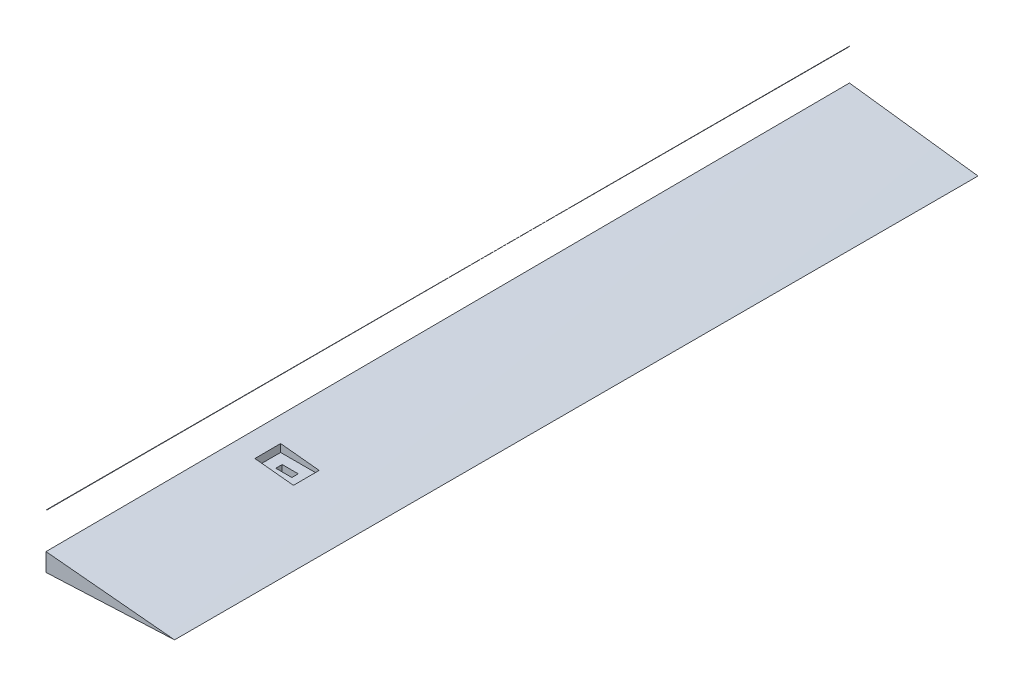
ISO-10303-21;
HEADER;
FILE_DESCRIPTION(('STEP AP214'),'2;1');
FILE_NAME('part.step','',(''),(''),'','','');
FILE_SCHEMA(('AUTOMOTIVE_DESIGN { 1 0 10303 214 1 1 1 1 }'));
ENDSEC;
DATA;
#1=APPLICATION_CONTEXT('core data for automotive mechanical design processes');
#2=APPLICATION_PROTOCOL_DEFINITION('international standard','automotive_design',2000,#1);
#3=PRODUCT_CONTEXT('',#1,'mechanical');
#4=PRODUCT('Part','Part','',(#3));
#5=PRODUCT_RELATED_PRODUCT_CATEGORY('part','',(#4));
#6=PRODUCT_DEFINITION_FORMATION('','',#4);
#7=PRODUCT_DEFINITION_CONTEXT('part definition',#1,'design');
#8=PRODUCT_DEFINITION('design','',#6,#7);
#9=PRODUCT_DEFINITION_SHAPE('','',#8);
#10=(LENGTH_UNIT() NAMED_UNIT(*) SI_UNIT(.MILLI.,.METRE.));
#11=(NAMED_UNIT(*) PLANE_ANGLE_UNIT() SI_UNIT($,.RADIAN.));
#12=(NAMED_UNIT(*) SI_UNIT($,.STERADIAN.) SOLID_ANGLE_UNIT());
#13=UNCERTAINTY_MEASURE_WITH_UNIT(LENGTH_MEASURE(1.E-05),#10,'distance_accuracy_value','');
#14=(GEOMETRIC_REPRESENTATION_CONTEXT(3) GLOBAL_UNCERTAINTY_ASSIGNED_CONTEXT((#13)) GLOBAL_UNIT_ASSIGNED_CONTEXT((#10,
#11,#12)) REPRESENTATION_CONTEXT('',''));
#15=CARTESIAN_POINT('',(0.,0.,0.));
#16=DIRECTION('',(0.,0.,1.));
#17=DIRECTION('',(1.,0.,0.));
#18=AXIS2_PLACEMENT_3D('',#15,#16,#17);
#19=CARTESIAN_POINT('',(0.,15.,125.));
#20=DIRECTION('',(1.,0.,0.));
#21=DIRECTION('',(0.,0.,-1.));
#22=AXIS2_PLACEMENT_3D('',#19,#20,#21);
#23=PLANE('',#22);
#24=DIRECTION('',(0.,-1.,0.));
#25=VECTOR('',#24,1.);
#26=CARTESIAN_POINT('',(0.,15.,-125.));
#27=LINE('',#26,#25);
#28=CARTESIAN_POINT('',(0.,15.,-125.));
#29=VERTEX_POINT('',#28);
#30=CARTESIAN_POINT('',(0.,14.8852225386253,-125.));
#31=VERTEX_POINT('',#30);
#32=EDGE_CURVE('E158',#29,#31,#27,.T.);
#33=ORIENTED_EDGE('',*,*,#32,.T.);
#34=DIRECTION('',(0.,0.000459109797112889,0.999999894609092));
#35=VECTOR('',#34,1.);
#36=CARTESIAN_POINT('',(0.,14.9426112693126,0.));
#37=LINE('',#36,#35);
#38=CARTESIAN_POINT('',(0.,15.,125.));
#39=VERTEX_POINT('',#38);
#40=EDGE_CURVE('E172',#31,#39,#37,.T.);
#41=ORIENTED_EDGE('',*,*,#40,.T.);
#42=DIRECTION('',(0.,0.,-1.));
#43=VECTOR('',#42,1.);
#44=CARTESIAN_POINT('',(0.,15.,125.));
#45=LINE('',#44,#43);
#46=EDGE_CURVE('E185',#39,#29,#45,.T.);
#47=ORIENTED_EDGE('',*,*,#46,.T.);
#48=EDGE_LOOP('',(#33,#41,#47));
#49=FACE_BOUND('',#48,.T.);
#50=ADVANCED_FACE('F155',(#49),#23,.F.);
#51=CARTESIAN_POINT('',(0.,15.,125.));
#52=DIRECTION('',(-0.170786723535938,-0.985308020399641,0.));
#53=DIRECTION('',(0.985308020399641,-0.170786723535938,0.));
#54=AXIS2_PLACEMENT_3D('',#51,#52,#53);
#55=PLANE('',#54);
#56=DIRECTION('',(-0.985308020399641,0.17078672353594,0.));
#57=VECTOR('',#56,1.);
#58=CARTESIAN_POINT('',(0.0645052676879048,14.9888190869341,125.));
#59=LINE('',#58,#57);
#60=CARTESIAN_POINT('',(0.129010535375803,14.9776381738682,125.));
#61=VERTEX_POINT('',#60);
#62=EDGE_CURVE('E13',#61,#39,#59,.T.);
#63=ORIENTED_EDGE('',*,*,#62,.F.);
#64=DIRECTION('',(0.000516042070727968,-8.94472922595131E-05,0.999999862849872));
#65=VECTOR('',#64,1.);
#66=CARTESIAN_POINT('',(0.0645052676879017,14.9888190869341,0.));
#67=LINE('',#66,#65);
#68=EDGE_CURVE('E164',#29,#61,#67,.T.);
#69=ORIENTED_EDGE('',*,*,#68,.F.);
#70=ORIENTED_EDGE('',*,*,#46,.F.);
#71=EDGE_LOOP('',(#63,#69,#70));
#72=FACE_BOUND('',#71,.T.);
#73=ADVANCED_FACE('F184',(#72),#55,.F.);
#74=CARTESIAN_POINT('',(0.,15.,-125.));
#75=CARTESIAN_POINT('',(0.12901053537581,14.9776381738682,125.));
#76=CARTESIAN_POINT('',(0.,14.8852225386253,-125.));
#77=CARTESIAN_POINT('',(0.,15.,125.));
#78=B_SPLINE_SURFACE_WITH_KNOTS('',1,1,((#74,#75),(#76,#77)),.UNSPECIFIED.,.F.,.F.,.F.,(2,2),(2,
2),(0.,1.),(0.,1.),.UNSPECIFIED.);
#79=ORIENTED_EDGE('',*,*,#32,.F.);
#80=ORIENTED_EDGE('',*,*,#68,.T.);
#81=ORIENTED_EDGE('',*,*,#62,.T.);
#82=ORIENTED_EDGE('',*,*,#40,.F.);
#83=EDGE_LOOP('',(#79,#80,#81,#82));
#84=FACE_BOUND('',#83,.T.);
#85=ADVANCED_FACE('F179',(#84),#78,.F.);
#86=CLOSED_SHELL('',(#50,#73,#85));
#87=MANIFOLD_SOLID_BREP('B2',#86);
#88=CARTESIAN_POINT('',(0.,15.,125.));
#89=DIRECTION('',(1.,0.,0.));
#90=DIRECTION('',(0.,0.,-1.));
#91=AXIS2_PLACEMENT_3D('',#88,#89,#90);
#92=PLANE('',#91);
#93=DIRECTION('',(0.,-1.,0.));
#94=VECTOR('',#93,1.);
#95=CARTESIAN_POINT('',(0.,1.28230630065368,95.));
#96=LINE('',#95,#94);
#97=CARTESIAN_POINT('',(0.,1.28230630065368,95.));
#98=VERTEX_POINT('',#97);
#99=CARTESIAN_POINT('',(0.,0.682306300653673,95.));
#100=VERTEX_POINT('',#99);
#101=EDGE_CURVE('E248',#98,#100,#96,.T.);
#102=ORIENTED_EDGE('',*,*,#101,.T.);
#103=DIRECTION('',(0.,0.,-1.));
#104=VECTOR('',#103,1.);
#105=CARTESIAN_POINT('',(0.,0.682306300653676,75.));
#106=LINE('',#105,#104);
#107=CARTESIAN_POINT('',(0.,0.682306300653676,75.));
#108=VERTEX_POINT('',#107);
#109=EDGE_CURVE('E403',#100,#108,#106,.T.);
#110=ORIENTED_EDGE('',*,*,#109,.T.);
#111=DIRECTION('',(0.,1.,0.));
#112=VECTOR('',#111,1.);
#113=CARTESIAN_POINT('',(0.,1.28230630065368,75.));
#114=LINE('',#113,#112);
#115=CARTESIAN_POINT('',(0.,1.28230630065368,75.));
#116=VERTEX_POINT('',#115);
#117=EDGE_CURVE('E399',#108,#116,#114,.T.);
#118=ORIENTED_EDGE('',*,*,#117,.T.);
#119=DIRECTION('',(0.,0.,1.));
#120=VECTOR('',#119,1.);
#121=CARTESIAN_POINT('',(0.,1.28230630065368,75.));
#122=LINE('',#121,#120);
#123=EDGE_CURVE('E396',#116,#98,#122,.T.);
#124=ORIENTED_EDGE('',*,*,#123,.T.);
#125=EDGE_LOOP('',(#102,#110,#118,#124));
#126=FACE_BOUND('',#125,.T.);
#127=DIRECTION('',(0.,-1.,0.));
#128=VECTOR('',#127,1.);
#129=CARTESIAN_POINT('',(0.,15.,125.));
#130=LINE('',#129,#128);
#131=CARTESIAN_POINT('',(0.,3.79304204037742,125.));
#132=VERTEX_POINT('',#131);
#133=CARTESIAN_POINT('',(0.,-1.82842943907007,125.));
#134=VERTEX_POINT('',#133);
#135=EDGE_CURVE('E481',#132,#134,#130,.T.);
#136=ORIENTED_EDGE('',*,*,#135,.F.);
#137=DIRECTION('',(0.,-0.00507239937573968,0.999987135299536));
#138=VECTOR('',#137,1.);
#139=CARTESIAN_POINT('',(-2.35922392732846E-13,4.42710011931214,0.));
#140=LINE('',#139,#138);
#141=CARTESIAN_POINT('',(-4.71844785465692E-13,5.06115819824686,-125.));
#142=VERTEX_POINT('',#141);
#143=EDGE_CURVE('E463',#142,#132,#140,.T.);
#144=ORIENTED_EDGE('',*,*,#143,.F.);
#145=DIRECTION('',(0.,-1.,0.));
#146=VECTOR('',#145,1.);
#147=CARTESIAN_POINT('',(0.,15.,-125.));
#148=LINE('',#147,#146);
#149=CARTESIAN_POINT('',(0.,-1.22896867148071,-125.));
#150=VERTEX_POINT('',#149);
#151=EDGE_CURVE('E465',#142,#150,#148,.T.);
#152=ORIENTED_EDGE('',*,*,#151,.T.);
#153=DIRECTION('',(0.,-0.00239783617700629,0.999997125186702));
#154=VECTOR('',#153,1.);
#155=CARTESIAN_POINT('',(-2.35922392732846E-13,-1.52869905527539,0.));
#156=LINE('',#155,#154);
#157=EDGE_CURVE('E475',#150,#134,#156,.T.);
#158=ORIENTED_EDGE('',*,*,#157,.T.);
#159=EDGE_LOOP('',(#136,#144,#152,#158));
#160=FACE_BOUND('',#159,.T.);
#161=DIRECTION('',(0.,1.,0.));
#162=VECTOR('',#161,1.);
#163=CARTESIAN_POINT('',(0.,1.61609476338308,-95.));
#164=LINE('',#163,#162);
#165=CARTESIAN_POINT('',(0.,1.61609476338308,-95.));
#166=VERTEX_POINT('',#165);
#167=CARTESIAN_POINT('',(0.,2.21609476338308,-95.));
#168=VERTEX_POINT('',#167);
#169=EDGE_CURVE('E240',#166,#168,#164,.T.);
#170=ORIENTED_EDGE('',*,*,#169,.T.);
#171=DIRECTION('',(0.,0.,1.));
#172=VECTOR('',#171,1.);
#173=CARTESIAN_POINT('',(0.,2.21609476338308,-75.));
#174=LINE('',#173,#172);
#175=CARTESIAN_POINT('',(0.,2.21609476338308,-75.));
#176=VERTEX_POINT('',#175);
#177=EDGE_CURVE('E376',#168,#176,#174,.T.);
#178=ORIENTED_EDGE('',*,*,#177,.T.);
#179=DIRECTION('',(0.,-1.,0.));
#180=VECTOR('',#179,1.);
#181=CARTESIAN_POINT('',(0.,1.61609476338308,-75.));
#182=LINE('',#181,#180);
#183=CARTESIAN_POINT('',(0.,1.61609476338308,-75.));
#184=VERTEX_POINT('',#183);
#185=EDGE_CURVE('E567',#176,#184,#182,.T.);
#186=ORIENTED_EDGE('',*,*,#185,.T.);
#187=DIRECTION('',(0.,0.,-1.));
#188=VECTOR('',#187,1.);
#189=CARTESIAN_POINT('',(0.,1.61609476338308,-75.));
#190=LINE('',#189,#188);
#191=EDGE_CURVE('E372',#184,#166,#190,.T.);
#192=ORIENTED_EDGE('',*,*,#191,.T.);
#193=EDGE_LOOP('',(#170,#178,#186,#192));
#194=FACE_BOUND('',#193,.T.);
#195=ADVANCED_FACE('F220',(#126,#160,#194),#92,.F.);
#196=CARTESIAN_POINT('',(-4.71844785465692E-13,5.06115819824686,-125.));
#197=CARTESIAN_POINT('',(0.,3.79304204037742,125.));
#198=CARTESIAN_POINT('',(39.9999910417339,0.,-125.));
#199=CARTESIAN_POINT('',(39.9999999999991,0.,125.));
#200=B_SPLINE_SURFACE_WITH_KNOTS('',1,1,((#196,#197),(#198,#199)),.UNSPECIFIED.,.F.,.F.,.F.,(2,
2),(2,2),(0.,1.),(0.,1.),.UNSPECIFIED.);
#201=DIRECTION('',(0.992090058637647,-0.12552814645469,0.));
#202=VECTOR('',#201,1.);
#203=CARTESIAN_POINT('',(19.9999955208667,2.53057909912343,-125.));
#204=LINE('',#203,#202);
#205=CARTESIAN_POINT('',(39.9999910417339,0.,-125.));
#206=VERTEX_POINT('',#205);
#207=EDGE_CURVE('E466',#142,#206,#204,.T.);
#208=DIRECTION('',(0.995534105483029,-0.0944025678681686,0.));
#209=VECTOR('',#208,1.);
#210=CARTESIAN_POINT('',(19.9999999999995,1.89652102018871,125.));
#211=LINE('',#210,#209);
#212=CARTESIAN_POINT('',(39.9999999999991,0.,125.));
#213=VERTEX_POINT('',#212);
#214=EDGE_CURVE('E478',#132,#213,#211,.T.);
#215=DIRECTION('',(3.58330607408419E-08,0.,0.999999999999999));
#216=VECTOR('',#215,1.);
#217=CARTESIAN_POINT('',(39.9999955208665,0.,0.));
#218=LINE('',#217,#216);
#219=EDGE_CURVE('E469',#206,#213,#218,.T.);
#220=CARTESIAN_POINT('',(7.,3.40545533978554,59.));
#221=CARTESIAN_POINT('',(7.,3.39429591944493,61.6666666666667));
#222=CARTESIAN_POINT('',(7.,3.38313649910432,64.3333333333333));
#223=CARTESIAN_POINT('',(7.,3.37197707876371,67.));
#224=B_SPLINE_CURVE_WITH_KNOTS('',3,(#220,#221,#222,#223),.UNSPECIFIED.,.F.,.F.,(4,4),(0.,
8.00007004931589),.UNSPECIFIED.);
#225=CARTESIAN_POINT('',(7.,3.40545533978554,59.));
#226=VERTEX_POINT('',#225);
#227=CARTESIAN_POINT('',(7.,3.37197707876371,67.));
#228=VERTEX_POINT('',#227);
#229=EDGE_CURVE('E153',#226,#228,#224,.T.);
#230=CARTESIAN_POINT('',(19.,2.1671078547523,59.));
#231=CARTESIAN_POINT('',(15.,2.57989034976338,59.));
#232=CARTESIAN_POINT('',(11.,2.99267284477446,59.));
#233=CARTESIAN_POINT('',(7.,3.40545533978554,59.));
#234=B_SPLINE_CURVE_WITH_KNOTS('',3,(#230,#231,#232,#233),.UNSPECIFIED.,.F.,.F.,(4,4),(0.,
12.0637268078189),.UNSPECIFIED.);
#235=CARTESIAN_POINT('',(19.,2.1671078547523,59.));
#236=VERTEX_POINT('',#235);
#237=EDGE_CURVE('E484',#236,#226,#234,.T.);
#238=CARTESIAN_POINT('',(19.,2.1458035183533,67.));
#239=CARTESIAN_POINT('',(19.,2.15290496381963,64.3333333333333));
#240=CARTESIAN_POINT('',(19.,2.16000640928596,61.6666666666667));
#241=CARTESIAN_POINT('',(19.,2.1671078547523,59.));
#242=B_SPLINE_CURVE_WITH_KNOTS('',3,(#238,#239,#240,#241),.UNSPECIFIED.,.F.,.F.,(4,4),(0.,
8.00002836712155),.UNSPECIFIED.);
#243=CARTESIAN_POINT('',(19.,2.1458035183533,67.));
#244=VERTEX_POINT('',#243);
#245=EDGE_CURVE('E493',#244,#236,#242,.T.);
#246=CARTESIAN_POINT('',(7.,3.37197707876371,67.));
#247=CARTESIAN_POINT('',(11.,2.96325255862691,67.));
#248=CARTESIAN_POINT('',(15.,2.5545280384901,67.));
#249=CARTESIAN_POINT('',(19.,2.1458035183533,67.));
#250=B_SPLINE_CURVE_WITH_KNOTS('',3,(#246,#247,#248,#249),.UNSPECIFIED.,.F.,.F.,(4,4),(0.,
12.0624832269417),.UNSPECIFIED.);
#251=EDGE_CURVE('E233',#228,#244,#250,.T.);
#252=ORIENTED_EDGE('',*,*,#207,.F.);
#253=ORIENTED_EDGE('',*,*,#143,.T.);
#254=ORIENTED_EDGE('',*,*,#214,.T.);
#255=ORIENTED_EDGE('',*,*,#219,.F.);
#256=EDGE_LOOP('',(#252,#253,#254,#255));
#257=FACE_BOUND('',#256,.T.);
#258=ORIENTED_EDGE('',*,*,#229,.F.);
#259=ORIENTED_EDGE('',*,*,#237,.F.);
#260=ORIENTED_EDGE('',*,*,#245,.F.);
#261=ORIENTED_EDGE('',*,*,#251,.F.);
#262=EDGE_LOOP('',(#258,#259,#260,#261));
#263=FACE_BOUND('',#262,.T.);
#264=ADVANCED_FACE('F499',(#257,#263),#200,.F.);
#265=CARTESIAN_POINT('',(0.,0.,-125.));
#266=DIRECTION('',(0.,0.,-1.));
#267=DIRECTION('',(-1.,0.,0.));
#268=AXIS2_PLACEMENT_3D('',#265,#266,#267);
#269=PLANE('',#268);
#270=ORIENTED_EDGE('',*,*,#207,.T.);
#271=DIRECTION('',(-0.99952834493772,-0.030709732432284,0.));
#272=VECTOR('',#271,1.);
#273=CARTESIAN_POINT('',(19.9999955208667,-0.614484335740353,-125.));
#274=LINE('',#273,#272);
#275=EDGE_CURVE('E472',#206,#150,#274,.T.);
#276=ORIENTED_EDGE('',*,*,#275,.T.);
#277=ORIENTED_EDGE('',*,*,#151,.F.);
#278=EDGE_LOOP('',(#270,#276,#277));
#279=FACE_BOUND('',#278,.T.);
#280=ADVANCED_FACE('F557',(#279),#269,.T.);
#281=CARTESIAN_POINT('',(0.,0.,125.));
#282=DIRECTION('',(0.,0.,-1.));
#283=DIRECTION('',(-1.,0.,0.));
#284=AXIS2_PLACEMENT_3D('',#281,#282,#283);
#285=PLANE('',#284);
#286=DIRECTION('',(-0.998956898671681,-0.0456630550473369,0.));
#287=VECTOR('',#286,1.);
#288=CARTESIAN_POINT('',(19.9999999999995,-0.914214719535032,125.));
#289=LINE('',#288,#287);
#290=EDGE_CURVE('E462',#213,#134,#289,.T.);
#291=ORIENTED_EDGE('',*,*,#290,.F.);
#292=ORIENTED_EDGE('',*,*,#214,.F.);
#293=ORIENTED_EDGE('',*,*,#135,.T.);
#294=EDGE_LOOP('',(#291,#292,#293));
#295=FACE_BOUND('',#294,.T.);
#296=ADVANCED_FACE('F759',(#295),#285,.F.);
#297=CARTESIAN_POINT('',(39.9999910417339,0.,-125.));
#298=CARTESIAN_POINT('',(39.9999999999991,0.,125.));
#299=CARTESIAN_POINT('',(-4.71844785465692E-13,-1.22896867148071,-125.));
#300=CARTESIAN_POINT('',(0.,-1.82842943907006,125.));
#301=B_SPLINE_SURFACE_WITH_KNOTS('',1,1,((#297,#298),(#299,#300)),.UNSPECIFIED.,.F.,.F.,.F.,(2,
2),(2,2),(0.,1.),(0.,1.),.UNSPECIFIED.);
#302=ORIENTED_EDGE('',*,*,#275,.F.);
#303=ORIENTED_EDGE('',*,*,#219,.T.);
#304=ORIENTED_EDGE('',*,*,#290,.T.);
#305=ORIENTED_EDGE('',*,*,#157,.F.);
#306=EDGE_LOOP('',(#302,#303,#304,#305));
#307=FACE_BOUND('',#306,.T.);
#308=ADVANCED_FACE('F746',(#307),#301,.F.);
#309=CARTESIAN_POINT('',(7.,15.,59.));
#310=DIRECTION('',(1.,0.,0.));
#311=DIRECTION('',(0.,0.,-1.));
#312=AXIS2_PLACEMENT_3D('',#309,#310,#311);
#313=PLANE('',#312);
#314=ORIENTED_EDGE('',*,*,#229,.T.);
#315=DIRECTION('',(0.,-1.,0.));
#316=VECTOR('',#315,1.);
#317=CARTESIAN_POINT('',(7.,15.,67.));
#318=LINE('',#317,#316);
#319=CARTESIAN_POINT('',(7.,1.,67.));
#320=VERTEX_POINT('',#319);
#321=EDGE_CURVE('E460',#228,#320,#318,.T.);
#322=ORIENTED_EDGE('',*,*,#321,.T.);
#323=DIRECTION('',(0.,0.,1.));
#324=VECTOR('',#323,1.);
#325=CARTESIAN_POINT('',(7.,1.,59.));
#326=LINE('',#325,#324);
#327=CARTESIAN_POINT('',(7.,1.,59.));
#328=VERTEX_POINT('',#327);
#329=EDGE_CURVE('E436',#328,#320,#326,.T.);
#330=ORIENTED_EDGE('',*,*,#329,.F.);
#331=DIRECTION('',(0.,-1.,0.));
#332=VECTOR('',#331,1.);
#333=CARTESIAN_POINT('',(7.,15.,59.));
#334=LINE('',#333,#332);
#335=EDGE_CURVE('E454',#226,#328,#334,.T.);
#336=ORIENTED_EDGE('',*,*,#335,.F.);
#337=EDGE_LOOP('',(#314,#322,#330,#336));
#338=FACE_BOUND('',#337,.T.);
#339=ADVANCED_FACE('F519',(#338),#313,.T.);
#340=CARTESIAN_POINT('',(7.,15.,67.));
#341=DIRECTION('',(0.,0.,-1.));
#342=DIRECTION('',(-1.,0.,0.));
#343=AXIS2_PLACEMENT_3D('',#340,#341,#342);
#344=PLANE('',#343);
#345=ORIENTED_EDGE('',*,*,#251,.T.);
#346=DIRECTION('',(0.,-1.,0.));
#347=VECTOR('',#346,1.);
#348=CARTESIAN_POINT('',(19.,15.,67.));
#349=LINE('',#348,#347);
#350=CARTESIAN_POINT('',(19.,1.,67.));
#351=VERTEX_POINT('',#350);
#352=EDGE_CURVE('E458',#244,#351,#349,.T.);
#353=ORIENTED_EDGE('',*,*,#352,.T.);
#354=DIRECTION('',(1.,0.,0.));
#355=VECTOR('',#354,1.);
#356=CARTESIAN_POINT('',(7.,1.,67.));
#357=LINE('',#356,#355);
#358=EDGE_CURVE('E445',#320,#351,#357,.T.);
#359=ORIENTED_EDGE('',*,*,#358,.F.);
#360=ORIENTED_EDGE('',*,*,#321,.F.);
#361=EDGE_LOOP('',(#345,#353,#359,#360));
#362=FACE_BOUND('',#361,.T.);
#363=ADVANCED_FACE('F515',(#362),#344,.T.);
#364=CARTESIAN_POINT('',(19.,15.,59.));
#365=DIRECTION('',(-1.,0.,0.));
#366=DIRECTION('',(0.,0.,1.));
#367=AXIS2_PLACEMENT_3D('',#364,#365,#366);
#368=PLANE('',#367);
#369=ORIENTED_EDGE('',*,*,#245,.T.);
#370=DIRECTION('',(0.,-1.,0.));
#371=VECTOR('',#370,1.);
#372=CARTESIAN_POINT('',(19.,15.,59.));
#373=LINE('',#372,#371);
#374=CARTESIAN_POINT('',(19.,1.,59.));
#375=VERTEX_POINT('',#374);
#376=EDGE_CURVE('E456',#236,#375,#373,.T.);
#377=ORIENTED_EDGE('',*,*,#376,.T.);
#378=DIRECTION('',(0.,0.,-1.));
#379=VECTOR('',#378,1.);
#380=CARTESIAN_POINT('',(19.,1.,59.));
#381=LINE('',#380,#379);
#382=EDGE_CURVE('E448',#351,#375,#381,.T.);
#383=ORIENTED_EDGE('',*,*,#382,.F.);
#384=ORIENTED_EDGE('',*,*,#352,.F.);
#385=EDGE_LOOP('',(#369,#377,#383,#384));
#386=FACE_BOUND('',#385,.T.);
#387=ADVANCED_FACE('F509',(#386),#368,.T.);
#388=CARTESIAN_POINT('',(7.,15.,59.));
#389=DIRECTION('',(0.,0.,1.));
#390=DIRECTION('',(1.,0.,0.));
#391=AXIS2_PLACEMENT_3D('',#388,#389,#390);
#392=PLANE('',#391);
#393=ORIENTED_EDGE('',*,*,#237,.T.);
#394=ORIENTED_EDGE('',*,*,#335,.T.);
#395=DIRECTION('',(-1.,0.,0.));
#396=VECTOR('',#395,1.);
#397=CARTESIAN_POINT('',(7.,1.,59.));
#398=LINE('',#397,#396);
#399=EDGE_CURVE('E451',#375,#328,#398,.T.);
#400=ORIENTED_EDGE('',*,*,#399,.F.);
#401=ORIENTED_EDGE('',*,*,#376,.F.);
#402=EDGE_LOOP('',(#393,#394,#400,#401));
#403=FACE_BOUND('',#402,.T.);
#404=ADVANCED_FACE('F504',(#403),#392,.T.);
#405=CARTESIAN_POINT('',(0.,1.,0.));
#406=DIRECTION('',(0.,1.,0.));
#407=DIRECTION('',(0.,0.,1.));
#408=AXIS2_PLACEMENT_3D('',#405,#406,#407);
#409=PLANE('',#408);
#410=DIRECTION('',(0.,0.,1.));
#411=VECTOR('',#410,1.);
#412=CARTESIAN_POINT('',(10.5,1.,64.));
#413=LINE('',#412,#411);
#414=CARTESIAN_POINT('',(10.5,1.,62.));
#415=VERTEX_POINT('',#414);
#416=CARTESIAN_POINT('',(10.5,1.,64.));
#417=VERTEX_POINT('',#416);
#418=EDGE_CURVE('E377',#415,#417,#413,.T.);
#419=ORIENTED_EDGE('',*,*,#418,.F.);
#420=DIRECTION('',(-1.,0.,0.));
#421=VECTOR('',#420,1.);
#422=CARTESIAN_POINT('',(15.5,1.,62.));
#423=LINE('',#422,#421);
#424=CARTESIAN_POINT('',(15.5,1.,62.));
#425=VERTEX_POINT('',#424);
#426=EDGE_CURVE('E418',#425,#415,#423,.T.);
#427=ORIENTED_EDGE('',*,*,#426,.F.);
#428=DIRECTION('',(0.,0.,-1.));
#429=VECTOR('',#428,1.);
#430=CARTESIAN_POINT('',(15.5,1.,64.));
#431=LINE('',#430,#429);
#432=CARTESIAN_POINT('',(15.5,1.,64.));
#433=VERTEX_POINT('',#432);
#434=EDGE_CURVE('E430',#433,#425,#431,.T.);
#435=ORIENTED_EDGE('',*,*,#434,.F.);
#436=DIRECTION('',(1.,0.,0.));
#437=VECTOR('',#436,1.);
#438=CARTESIAN_POINT('',(15.5,1.,64.));
#439=LINE('',#438,#437);
#440=EDGE_CURVE('E381',#417,#433,#439,.T.);
#441=ORIENTED_EDGE('',*,*,#440,.F.);
#442=EDGE_LOOP('',(#419,#427,#435,#441));
#443=FACE_BOUND('',#442,.T.);
#444=ORIENTED_EDGE('',*,*,#329,.T.);
#445=ORIENTED_EDGE('',*,*,#358,.T.);
#446=ORIENTED_EDGE('',*,*,#382,.T.);
#447=ORIENTED_EDGE('',*,*,#399,.T.);
#448=EDGE_LOOP('',(#444,#445,#446,#447));
#449=FACE_BOUND('',#448,.T.);
#450=ADVANCED_FACE('F508',(#443,#449),#409,.T.);
#451=CARTESIAN_POINT('',(10.5,-1.,64.));
#452=DIRECTION('',(-1.,0.,0.));
#453=DIRECTION('',(0.,0.,1.));
#454=AXIS2_PLACEMENT_3D('',#451,#452,#453);
#455=PLANE('',#454);
#456=ORIENTED_EDGE('',*,*,#418,.T.);
#457=DIRECTION('',(0.,1.,0.));
#458=VECTOR('',#457,1.);
#459=CARTESIAN_POINT('',(10.5,-1.,64.));
#460=LINE('',#459,#458);
#461=CARTESIAN_POINT('',(10.5,-1.,64.));
#462=VERTEX_POINT('',#461);
#463=EDGE_CURVE('E426',#462,#417,#460,.T.);
#464=ORIENTED_EDGE('',*,*,#463,.F.);
#465=DIRECTION('',(0.,0.,1.));
#466=VECTOR('',#465,1.);
#467=CARTESIAN_POINT('',(10.5,-1.,64.));
#468=LINE('',#467,#466);
#469=CARTESIAN_POINT('',(10.5,-1.,62.));
#470=VERTEX_POINT('',#469);
#471=EDGE_CURVE('E414',#470,#462,#468,.T.);
#472=ORIENTED_EDGE('',*,*,#471,.F.);
#473=DIRECTION('',(0.,1.,0.));
#474=VECTOR('',#473,1.);
#475=CARTESIAN_POINT('',(10.5,-1.,62.));
#476=LINE('',#475,#474);
#477=EDGE_CURVE('E434',#470,#415,#476,.T.);
#478=ORIENTED_EDGE('',*,*,#477,.T.);
#479=EDGE_LOOP('',(#456,#464,#472,#478));
#480=FACE_BOUND('',#479,.T.);
#481=ADVANCED_FACE('F542',(#480),#455,.F.);
#482=CARTESIAN_POINT('',(15.5,-1.,62.));
#483=DIRECTION('',(0.,0.,-1.));
#484=DIRECTION('',(-1.,0.,0.));
#485=AXIS2_PLACEMENT_3D('',#482,#483,#484);
#486=PLANE('',#485);
#487=ORIENTED_EDGE('',*,*,#426,.T.);
#488=ORIENTED_EDGE('',*,*,#477,.F.);
#489=DIRECTION('',(-1.,0.,0.));
#490=VECTOR('',#489,1.);
#491=CARTESIAN_POINT('',(15.5,-1.,62.));
#492=LINE('',#491,#490);
#493=CARTESIAN_POINT('',(15.5,-1.,62.));
#494=VERTEX_POINT('',#493);
#495=EDGE_CURVE('E424',#494,#470,#492,.T.);
#496=ORIENTED_EDGE('',*,*,#495,.F.);
#497=DIRECTION('',(0.,1.,0.));
#498=VECTOR('',#497,1.);
#499=CARTESIAN_POINT('',(15.5,-1.,62.));
#500=LINE('',#499,#498);
#501=EDGE_CURVE('E437',#494,#425,#500,.T.);
#502=ORIENTED_EDGE('',*,*,#501,.T.);
#503=EDGE_LOOP('',(#487,#488,#496,#502));
#504=FACE_BOUND('',#503,.T.);
#505=ADVANCED_FACE('F547',(#504),#486,.F.);
#506=CARTESIAN_POINT('',(15.5,-1.,64.));
#507=DIRECTION('',(1.,0.,0.));
#508=DIRECTION('',(0.,0.,-1.));
#509=AXIS2_PLACEMENT_3D('',#506,#507,#508);
#510=PLANE('',#509);
#511=ORIENTED_EDGE('',*,*,#434,.T.);
#512=ORIENTED_EDGE('',*,*,#501,.F.);
#513=DIRECTION('',(0.,0.,-1.));
#514=VECTOR('',#513,1.);
#515=CARTESIAN_POINT('',(15.5,-1.,64.));
#516=LINE('',#515,#514);
#517=CARTESIAN_POINT('',(15.5,-1.,64.));
#518=VERTEX_POINT('',#517);
#519=EDGE_CURVE('E421',#518,#494,#516,.T.);
#520=ORIENTED_EDGE('',*,*,#519,.F.);
#521=DIRECTION('',(0.,1.,0.));
#522=VECTOR('',#521,1.);
#523=CARTESIAN_POINT('',(15.5,-1.,64.));
#524=LINE('',#523,#522);
#525=EDGE_CURVE('E440',#518,#433,#524,.T.);
#526=ORIENTED_EDGE('',*,*,#525,.T.);
#527=EDGE_LOOP('',(#511,#512,#520,#526));
#528=FACE_BOUND('',#527,.T.);
#529=ADVANCED_FACE('F618',(#528),#510,.F.);
#530=CARTESIAN_POINT('',(15.5,-1.,64.));
#531=DIRECTION('',(0.,0.,1.));
#532=DIRECTION('',(1.,0.,0.));
#533=AXIS2_PLACEMENT_3D('',#530,#531,#532);
#534=PLANE('',#533);
#535=ORIENTED_EDGE('',*,*,#440,.T.);
#536=ORIENTED_EDGE('',*,*,#525,.F.);
#537=DIRECTION('',(1.,0.,0.));
#538=VECTOR('',#537,1.);
#539=CARTESIAN_POINT('',(15.5,-1.,64.));
#540=LINE('',#539,#538);
#541=EDGE_CURVE('E417',#462,#518,#540,.T.);
#542=ORIENTED_EDGE('',*,*,#541,.F.);
#543=ORIENTED_EDGE('',*,*,#463,.T.);
#544=EDGE_LOOP('',(#535,#536,#542,#543));
#545=FACE_BOUND('',#544,.T.);
#546=ADVANCED_FACE('F614',(#545),#534,.F.);
#547=CARTESIAN_POINT('',(0.,-1.,0.));
#548=DIRECTION('',(0.,1.,0.));
#549=DIRECTION('',(0.,0.,1.));
#550=AXIS2_PLACEMENT_3D('',#547,#548,#549);
#551=PLANE('',#550);
#552=ORIENTED_EDGE('',*,*,#471,.T.);
#553=ORIENTED_EDGE('',*,*,#541,.T.);
#554=ORIENTED_EDGE('',*,*,#519,.T.);
#555=ORIENTED_EDGE('',*,*,#495,.T.);
#556=EDGE_LOOP('',(#552,#553,#554,#555));
#557=FACE_BOUND('',#556,.T.);
#558=ADVANCED_FACE('F598',(#557),#551,.T.);
#559=CARTESIAN_POINT('',(12.5,1.28230630065368,95.));
#560=DIRECTION('',(0.,0.,-1.));
#561=DIRECTION('',(-1.,0.,0.));
#562=AXIS2_PLACEMENT_3D('',#559,#560,#561);
#563=PLANE('',#562);
#564=ORIENTED_EDGE('',*,*,#101,.F.);
#565=DIRECTION('',(-1.,0.,0.));
#566=VECTOR('',#565,1.);
#567=CARTESIAN_POINT('',(12.5,1.28230630065368,95.));
#568=LINE('',#567,#566);
#569=CARTESIAN_POINT('',(12.5,1.28230630065368,95.));
#570=VERTEX_POINT('',#569);
#571=EDGE_CURVE('E393',#570,#98,#568,.T.);
#572=ORIENTED_EDGE('',*,*,#571,.F.);
#573=DIRECTION('',(0.,-1.,0.));
#574=VECTOR('',#573,1.);
#575=CARTESIAN_POINT('',(12.5,1.28230630065368,95.));
#576=LINE('',#575,#574);
#577=CARTESIAN_POINT('',(12.5,0.682306300653673,95.));
#578=VERTEX_POINT('',#577);
#579=EDGE_CURVE('E400',#570,#578,#576,.T.);
#580=ORIENTED_EDGE('',*,*,#579,.T.);
#581=DIRECTION('',(-1.,0.,0.));
#582=VECTOR('',#581,1.);
#583=CARTESIAN_POINT('',(12.5,0.682306300653673,95.));
#584=LINE('',#583,#582);
#585=EDGE_CURVE('E387',#578,#100,#584,.T.);
#586=ORIENTED_EDGE('',*,*,#585,.T.);
#587=EDGE_LOOP('',(#564,#572,#580,#586));
#588=FACE_BOUND('',#587,.T.);
#589=ADVANCED_FACE('F595',(#588),#563,.T.);
#590=CARTESIAN_POINT('',(12.5,0.682306300653676,75.));
#591=DIRECTION('',(0.,1.,0.));
#592=DIRECTION('',(0.,0.,1.));
#593=AXIS2_PLACEMENT_3D('',#590,#591,#592);
#594=PLANE('',#593);
#595=ORIENTED_EDGE('',*,*,#109,.F.);
#596=ORIENTED_EDGE('',*,*,#585,.F.);
#597=DIRECTION('',(0.,0.,-1.));
#598=VECTOR('',#597,1.);
#599=CARTESIAN_POINT('',(12.5,0.682306300653676,75.));
#600=LINE('',#599,#598);
#601=CARTESIAN_POINT('',(12.5,0.682306300653676,75.));
#602=VERTEX_POINT('',#601);
#603=EDGE_CURVE('E410',#578,#602,#600,.T.);
#604=ORIENTED_EDGE('',*,*,#603,.T.);
#605=DIRECTION('',(-1.,0.,0.));
#606=VECTOR('',#605,1.);
#607=CARTESIAN_POINT('',(12.5,0.682306300653676,75.));
#608=LINE('',#607,#606);
#609=EDGE_CURVE('E389',#602,#108,#608,.T.);
#610=ORIENTED_EDGE('',*,*,#609,.T.);
#611=EDGE_LOOP('',(#595,#596,#604,#610));
#612=FACE_BOUND('',#611,.T.);
#613=ADVANCED_FACE('F597',(#612),#594,.T.);
#614=CARTESIAN_POINT('',(12.5,1.28230630065368,75.));
#615=DIRECTION('',(0.,0.,1.));
#616=DIRECTION('',(1.,0.,0.));
#617=AXIS2_PLACEMENT_3D('',#614,#615,#616);
#618=PLANE('',#617);
#619=ORIENTED_EDGE('',*,*,#117,.F.);
#620=ORIENTED_EDGE('',*,*,#609,.F.);
#621=DIRECTION('',(0.,1.,0.));
#622=VECTOR('',#621,1.);
#623=CARTESIAN_POINT('',(12.5,1.28230630065368,75.));
#624=LINE('',#623,#622);
#625=CARTESIAN_POINT('',(12.5,1.28230630065368,75.));
#626=VERTEX_POINT('',#625);
#627=EDGE_CURVE('E408',#602,#626,#624,.T.);
#628=ORIENTED_EDGE('',*,*,#627,.T.);
#629=DIRECTION('',(-1.,0.,0.));
#630=VECTOR('',#629,1.);
#631=CARTESIAN_POINT('',(12.5,1.28230630065368,75.));
#632=LINE('',#631,#630);
#633=EDGE_CURVE('E391',#626,#116,#632,.T.);
#634=ORIENTED_EDGE('',*,*,#633,.T.);
#635=EDGE_LOOP('',(#619,#620,#628,#634));
#636=FACE_BOUND('',#635,.T.);
#637=ADVANCED_FACE('F601',(#636),#618,.T.);
#638=CARTESIAN_POINT('',(12.5,1.28230630065368,75.));
#639=DIRECTION('',(0.,-1.,0.));
#640=DIRECTION('',(0.,0.,-1.));
#641=AXIS2_PLACEMENT_3D('',#638,#639,#640);
#642=PLANE('',#641);
#643=ORIENTED_EDGE('',*,*,#123,.F.);
#644=ORIENTED_EDGE('',*,*,#633,.F.);
#645=DIRECTION('',(0.,0.,1.));
#646=VECTOR('',#645,1.);
#647=CARTESIAN_POINT('',(12.5,1.28230630065368,75.));
#648=LINE('',#647,#646);
#649=EDGE_CURVE('E395',#626,#570,#648,.T.);
#650=ORIENTED_EDGE('',*,*,#649,.T.);
#651=ORIENTED_EDGE('',*,*,#571,.T.);
#652=EDGE_LOOP('',(#643,#644,#650,#651));
#653=FACE_BOUND('',#652,.T.);
#654=ADVANCED_FACE('F605',(#653),#642,.T.);
#655=CARTESIAN_POINT('',(12.5,0.,0.));
#656=DIRECTION('',(-1.,0.,0.));
#657=DIRECTION('',(0.,0.,1.));
#658=AXIS2_PLACEMENT_3D('',#655,#656,#657);
#659=PLANE('',#658);
#660=ORIENTED_EDGE('',*,*,#579,.F.);
#661=ORIENTED_EDGE('',*,*,#649,.F.);
#662=ORIENTED_EDGE('',*,*,#627,.F.);
#663=ORIENTED_EDGE('',*,*,#603,.F.);
#664=EDGE_LOOP('',(#660,#661,#662,#663));
#665=FACE_BOUND('',#664,.T.);
#666=ADVANCED_FACE('F594',(#665),#659,.T.);
#667=CARTESIAN_POINT('',(12.5,1.61609476338308,-95.));
#668=DIRECTION('',(0.,0.,1.));
#669=DIRECTION('',(1.,0.,0.));
#670=AXIS2_PLACEMENT_3D('',#667,#668,#669);
#671=PLANE('',#670);
#672=ORIENTED_EDGE('',*,*,#169,.F.);
#673=DIRECTION('',(-1.,0.,0.));
#674=VECTOR('',#673,1.);
#675=CARTESIAN_POINT('',(12.5,1.61609476338308,-95.));
#676=LINE('',#675,#674);
#677=CARTESIAN_POINT('',(12.5,1.61609476338308,-95.));
#678=VERTEX_POINT('',#677);
#679=EDGE_CURVE('E371',#678,#166,#676,.T.);
#680=ORIENTED_EDGE('',*,*,#679,.F.);
#681=DIRECTION('',(0.,1.,0.));
#682=VECTOR('',#681,1.);
#683=CARTESIAN_POINT('',(12.5,1.61609476338308,-95.));
#684=LINE('',#683,#682);
#685=CARTESIAN_POINT('',(12.5,2.21609476338308,-95.));
#686=VERTEX_POINT('',#685);
#687=EDGE_CURVE('E363',#678,#686,#684,.T.);
#688=ORIENTED_EDGE('',*,*,#687,.T.);
#689=DIRECTION('',(-1.,0.,0.));
#690=VECTOR('',#689,1.);
#691=CARTESIAN_POINT('',(12.5,2.21609476338308,-95.));
#692=LINE('',#691,#690);
#693=EDGE_CURVE('E370',#686,#168,#692,.T.);
#694=ORIENTED_EDGE('',*,*,#693,.T.);
#695=EDGE_LOOP('',(#672,#680,#688,#694));
#696=FACE_BOUND('',#695,.T.);
#697=ADVANCED_FACE('F369',(#696),#671,.T.);
#698=CARTESIAN_POINT('',(12.5,2.21609476338308,-75.));
#699=DIRECTION('',(0.,-1.,0.));
#700=DIRECTION('',(0.,0.,-1.));
#701=AXIS2_PLACEMENT_3D('',#698,#699,#700);
#702=PLANE('',#701);
#703=ORIENTED_EDGE('',*,*,#177,.F.);
#704=ORIENTED_EDGE('',*,*,#693,.F.);
#705=DIRECTION('',(0.,0.,1.));
#706=VECTOR('',#705,1.);
#707=CARTESIAN_POINT('',(12.5,2.21609476338308,-75.));
#708=LINE('',#707,#706);
#709=CARTESIAN_POINT('',(12.5,2.21609476338308,-75.));
#710=VERTEX_POINT('',#709);
#711=EDGE_CURVE('E359',#686,#710,#708,.T.);
#712=ORIENTED_EDGE('',*,*,#711,.T.);
#713=DIRECTION('',(-1.,0.,0.));
#714=VECTOR('',#713,1.);
#715=CARTESIAN_POINT('',(12.5,2.21609476338308,-75.));
#716=LINE('',#715,#714);
#717=EDGE_CURVE('E378',#710,#176,#716,.T.);
#718=ORIENTED_EDGE('',*,*,#717,.T.);
#719=EDGE_LOOP('',(#703,#704,#712,#718));
#720=FACE_BOUND('',#719,.T.);
#721=ADVANCED_FACE('F374',(#720),#702,.T.);
#722=CARTESIAN_POINT('',(12.5,1.61609476338308,-75.));
#723=DIRECTION('',(0.,0.,-1.));
#724=DIRECTION('',(-1.,0.,0.));
#725=AXIS2_PLACEMENT_3D('',#722,#723,#724);
#726=PLANE('',#725);
#727=ORIENTED_EDGE('',*,*,#185,.F.);
#728=ORIENTED_EDGE('',*,*,#717,.F.);
#729=DIRECTION('',(0.,-1.,0.));
#730=VECTOR('',#729,1.);
#731=CARTESIAN_POINT('',(12.5,1.61609476338308,-75.));
#732=LINE('',#731,#730);
#733=CARTESIAN_POINT('',(12.5,1.61609476338308,-75.));
#734=VERTEX_POINT('',#733);
#735=EDGE_CURVE('E364',#710,#734,#732,.T.);
#736=ORIENTED_EDGE('',*,*,#735,.T.);
#737=DIRECTION('',(-1.,0.,0.));
#738=VECTOR('',#737,1.);
#739=CARTESIAN_POINT('',(12.5,1.61609476338308,-75.));
#740=LINE('',#739,#738);
#741=EDGE_CURVE('E383',#734,#184,#740,.T.);
#742=ORIENTED_EDGE('',*,*,#741,.T.);
#743=EDGE_LOOP('',(#727,#728,#736,#742));
#744=FACE_BOUND('',#743,.T.);
#745=ADVANCED_FACE('F578',(#744),#726,.T.);
#746=CARTESIAN_POINT('',(12.5,1.61609476338308,-75.));
#747=DIRECTION('',(0.,1.,0.));
#748=DIRECTION('',(0.,0.,1.));
#749=AXIS2_PLACEMENT_3D('',#746,#747,#748);
#750=PLANE('',#749);
#751=ORIENTED_EDGE('',*,*,#191,.F.);
#752=ORIENTED_EDGE('',*,*,#741,.F.);
#753=DIRECTION('',(0.,0.,-1.));
#754=VECTOR('',#753,1.);
#755=CARTESIAN_POINT('',(12.5,1.61609476338308,-75.));
#756=LINE('',#755,#754);
#757=EDGE_CURVE('E570',#734,#678,#756,.T.);
#758=ORIENTED_EDGE('',*,*,#757,.T.);
#759=ORIENTED_EDGE('',*,*,#679,.T.);
#760=EDGE_LOOP('',(#751,#752,#758,#759));
#761=FACE_BOUND('',#760,.T.);
#762=ADVANCED_FACE('F580',(#761),#750,.T.);
#763=CARTESIAN_POINT('',(12.5,0.,0.));
#764=DIRECTION('',(-1.,0.,0.));
#765=DIRECTION('',(0.,0.,1.));
#766=AXIS2_PLACEMENT_3D('',#763,#764,#765);
#767=PLANE('',#766);
#768=ORIENTED_EDGE('',*,*,#687,.F.);
#769=ORIENTED_EDGE('',*,*,#757,.F.);
#770=ORIENTED_EDGE('',*,*,#735,.F.);
#771=ORIENTED_EDGE('',*,*,#711,.F.);
#772=EDGE_LOOP('',(#768,#769,#770,#771));
#773=FACE_BOUND('',#772,.T.);
#774=ADVANCED_FACE('F361',(#773),#767,.T.);
#775=CLOSED_SHELL('',(#195,#264,#280,#296,#308,#339,#363,#387,#404,#450,#481,#505,#529,#546,
#558,#589,#613,#637,#654,#666,#697,#721,#745,#762,#774));
#776=MANIFOLD_SOLID_BREP('B7',#775);
#777=ADVANCED_BREP_SHAPE_REPRESENTATION('',(#18,#87,#776),#14);
#778=SHAPE_DEFINITION_REPRESENTATION(#9,#777);
ENDSEC;
END-ISO-10303-21;
